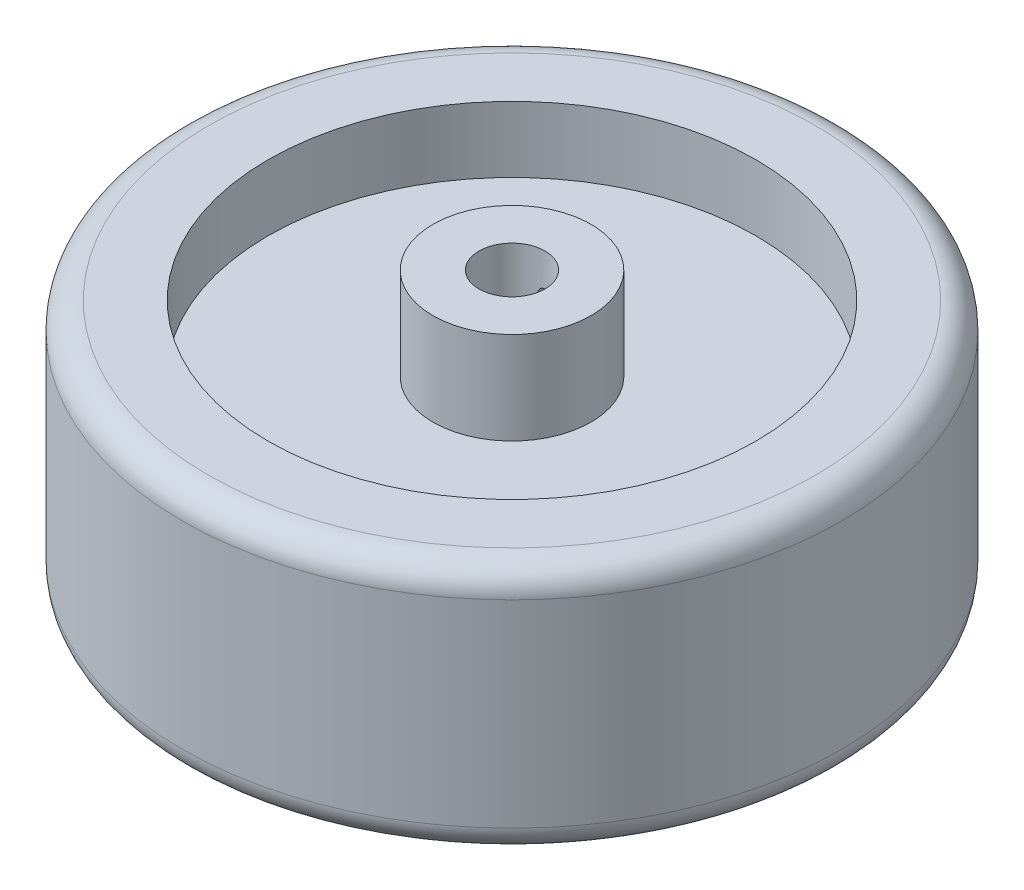
ISO-10303-21;
HEADER;
FILE_DESCRIPTION(('STEP AP214'),'2;1');
FILE_NAME('part.step','',(''),(''),'','','');
FILE_SCHEMA(('AUTOMOTIVE_DESIGN { 1 0 10303 214 1 1 1 1 }'));
ENDSEC;
DATA;
#1=APPLICATION_CONTEXT('core data for automotive mechanical design processes');
#2=APPLICATION_PROTOCOL_DEFINITION('international standard','automotive_design',2000,#1);
#3=PRODUCT_CONTEXT('',#1,'mechanical');
#4=PRODUCT('Part','Part','',(#3));
#5=PRODUCT_RELATED_PRODUCT_CATEGORY('part','',(#4));
#6=PRODUCT_DEFINITION_FORMATION('','',#4);
#7=PRODUCT_DEFINITION_CONTEXT('part definition',#1,'design');
#8=PRODUCT_DEFINITION('design','',#6,#7);
#9=PRODUCT_DEFINITION_SHAPE('','',#8);
#10=(LENGTH_UNIT() NAMED_UNIT(*) SI_UNIT(.MILLI.,.METRE.));
#11=(NAMED_UNIT(*) PLANE_ANGLE_UNIT() SI_UNIT($,.RADIAN.));
#12=(NAMED_UNIT(*) SI_UNIT($,.STERADIAN.) SOLID_ANGLE_UNIT());
#13=UNCERTAINTY_MEASURE_WITH_UNIT(LENGTH_MEASURE(1.E-05),#10,'distance_accuracy_value','');
#14=(GEOMETRIC_REPRESENTATION_CONTEXT(3) GLOBAL_UNCERTAINTY_ASSIGNED_CONTEXT((#13)) GLOBAL_UNIT_ASSIGNED_CONTEXT((#10,
#11,#12)) REPRESENTATION_CONTEXT('',''));
#15=CARTESIAN_POINT('',(0.,0.,0.));
#16=DIRECTION('',(0.,0.,1.));
#17=DIRECTION('',(1.,0.,0.));
#18=AXIS2_PLACEMENT_3D('',#15,#16,#17);
#19=CARTESIAN_POINT('',(0.,38.,0.));
#20=DIRECTION('',(0.,-1.,0.));
#21=DIRECTION('',(0.,0.,-1.));
#22=AXIS2_PLACEMENT_3D('',#19,#20,#21);
#23=CYLINDRICAL_SURFACE('',#22,50.);
#24=CARTESIAN_POINT('',(0.,34.,0.));
#25=DIRECTION('',(0.,1.,0.));
#26=DIRECTION('',(0.,0.,1.));
#27=AXIS2_PLACEMENT_3D('',#24,#25,#26);
#28=CIRCLE('',#27,50.);
#29=CARTESIAN_POINT('',(0.,34.,50.));
#30=VERTEX_POINT('',#29);
#31=EDGE_CURVE('E48',#30,#30,#28,.F.);
#32=ORIENTED_EDGE('',*,*,#31,.T.);
#33=EDGE_LOOP('',(#32));
#34=FACE_BOUND('',#33,.T.);
#35=CARTESIAN_POINT('',(0.,4.,0.));
#36=DIRECTION('',(0.,1.,0.));
#37=DIRECTION('',(0.,0.,1.));
#38=AXIS2_PLACEMENT_3D('',#35,#36,#37);
#39=CIRCLE('',#38,50.);
#40=CARTESIAN_POINT('',(0.,4.,50.));
#41=VERTEX_POINT('',#40);
#42=EDGE_CURVE('E52',#41,#41,#39,.T.);
#43=ORIENTED_EDGE('',*,*,#42,.T.);
#44=EDGE_LOOP('',(#43));
#45=FACE_BOUND('',#44,.T.);
#46=ADVANCED_FACE('F36',(#34,#45),#23,.T.);
#47=CARTESIAN_POINT('',(0.,38.,0.));
#48=DIRECTION('',(0.,1.,0.));
#49=DIRECTION('',(0.,0.,1.));
#50=AXIS2_PLACEMENT_3D('',#47,#48,#49);
#51=PLANE('',#50);
#52=CARTESIAN_POINT('',(0.,38.,0.));
#53=DIRECTION('',(0.,1.,0.));
#54=DIRECTION('',(0.,0.,1.));
#55=AXIS2_PLACEMENT_3D('',#52,#53,#54);
#56=CIRCLE('',#55,46.);
#57=CARTESIAN_POINT('',(0.,38.,46.));
#58=VERTEX_POINT('',#57);
#59=EDGE_CURVE('E57',#58,#58,#56,.T.);
#60=ORIENTED_EDGE('',*,*,#59,.T.);
#61=EDGE_LOOP('',(#60));
#62=FACE_BOUND('',#61,.T.);
#63=CARTESIAN_POINT('',(0.,38.,0.));
#64=DIRECTION('',(0.,1.,0.));
#65=DIRECTION('',(0.,0.,1.));
#66=AXIS2_PLACEMENT_3D('',#63,#64,#65);
#67=CIRCLE('',#66,37.);
#68=CARTESIAN_POINT('',(0.,38.,37.));
#69=VERTEX_POINT('',#68);
#70=EDGE_CURVE('E82',#69,#69,#67,.T.);
#71=ORIENTED_EDGE('',*,*,#70,.F.);
#72=EDGE_LOOP('',(#71));
#73=FACE_BOUND('',#72,.T.);
#74=ADVANCED_FACE('F136',(#62,#73),#51,.T.);
#75=CARTESIAN_POINT('',(0.,0.,0.));
#76=DIRECTION('',(0.,1.,0.));
#77=DIRECTION('',(0.,0.,1.));
#78=AXIS2_PLACEMENT_3D('',#75,#76,#77);
#79=PLANE('',#78);
#80=CARTESIAN_POINT('',(0.,0.,0.));
#81=DIRECTION('',(0.,1.,0.));
#82=DIRECTION('',(0.,0.,1.));
#83=AXIS2_PLACEMENT_3D('',#80,#81,#82);
#84=CIRCLE('',#83,46.);
#85=CARTESIAN_POINT('',(0.,0.,46.));
#86=VERTEX_POINT('',#85);
#87=EDGE_CURVE('E11',#86,#86,#84,.F.);
#88=ORIENTED_EDGE('',*,*,#87,.T.);
#89=EDGE_LOOP('',(#88));
#90=FACE_BOUND('',#89,.T.);
#91=CARTESIAN_POINT('',(0.,0.,0.));
#92=DIRECTION('',(0.,-1.,0.));
#93=DIRECTION('',(0.,0.,-1.));
#94=AXIS2_PLACEMENT_3D('',#91,#92,#93);
#95=CIRCLE('',#94,37.);
#96=CARTESIAN_POINT('',(0.,0.,-37.));
#97=VERTEX_POINT('',#96);
#98=EDGE_CURVE('E73',#97,#97,#95,.T.);
#99=ORIENTED_EDGE('',*,*,#98,.F.);
#100=EDGE_LOOP('',(#99));
#101=FACE_BOUND('',#100,.T.);
#102=ADVANCED_FACE('F128',(#90,#101),#79,.F.);
#103=CARTESIAN_POINT('',(0.,-4.,0.));
#104=DIRECTION('',(0.,-1.,0.));
#105=DIRECTION('',(0.,0.,-1.));
#106=AXIS2_PLACEMENT_3D('',#103,#104,#105);
#107=PLANE('',#106);
#108=CARTESIAN_POINT('',(0.,-4.,0.));
#109=DIRECTION('',(0.,-1.,0.));
#110=DIRECTION('',(0.,0.,-1.));
#111=AXIS2_PLACEMENT_3D('',#108,#109,#110);
#112=CIRCLE('',#111,5.);
#113=CARTESIAN_POINT('',(0.,-4.,-5.));
#114=VERTEX_POINT('',#113);
#115=EDGE_CURVE('E65',#114,#114,#112,.T.);
#116=ORIENTED_EDGE('',*,*,#115,.F.);
#117=EDGE_LOOP('',(#116));
#118=FACE_BOUND('',#117,.T.);
#119=CARTESIAN_POINT('',(0.,-4.,0.));
#120=DIRECTION('',(0.,-1.,0.));
#121=DIRECTION('',(0.,0.,-1.));
#122=AXIS2_PLACEMENT_3D('',#119,#120,#121);
#123=CIRCLE('',#122,12.);
#124=CARTESIAN_POINT('',(0.,-4.,-12.));
#125=VERTEX_POINT('',#124);
#126=EDGE_CURVE('E64',#125,#125,#123,.T.);
#127=ORIENTED_EDGE('',*,*,#126,.T.);
#128=EDGE_LOOP('',(#127));
#129=FACE_BOUND('',#128,.T.);
#130=ADVANCED_FACE('F125',(#118,#129),#107,.T.);
#131=CARTESIAN_POINT('',(0.,79.9411254969543,0.));
#132=DIRECTION('',(0.,-1.,0.));
#133=DIRECTION('',(0.,0.,-1.));
#134=AXIS2_PLACEMENT_3D('',#131,#132,#133);
#135=CYLINDRICAL_SURFACE('',#134,12.);
#136=ORIENTED_EDGE('',*,*,#126,.F.);
#137=EDGE_LOOP('',(#136));
#138=FACE_BOUND('',#137,.T.);
#139=CARTESIAN_POINT('',(0.,10.,0.));
#140=DIRECTION('',(0.,-1.,0.));
#141=DIRECTION('',(0.,0.,-1.));
#142=AXIS2_PLACEMENT_3D('',#139,#140,#141);
#143=CIRCLE('',#142,12.);
#144=CARTESIAN_POINT('',(0.,10.,-12.));
#145=VERTEX_POINT('',#144);
#146=EDGE_CURVE('E76',#145,#145,#143,.T.);
#147=ORIENTED_EDGE('',*,*,#146,.T.);
#148=EDGE_LOOP('',(#147));
#149=FACE_BOUND('',#148,.T.);
#150=ADVANCED_FACE('F127',(#138,#149),#135,.T.);
#151=CARTESIAN_POINT('',(0.,42.,0.));
#152=DIRECTION('',(0.,1.,0.));
#153=DIRECTION('',(0.,0.,1.));
#154=AXIS2_PLACEMENT_3D('',#151,#152,#153);
#155=PLANE('',#154);
#156=CARTESIAN_POINT('',(0.,42.,0.));
#157=DIRECTION('',(0.,1.,0.));
#158=DIRECTION('',(0.,0.,1.));
#159=AXIS2_PLACEMENT_3D('',#156,#157,#158);
#160=CIRCLE('',#159,5.);
#161=CARTESIAN_POINT('',(0.,42.,5.));
#162=VERTEX_POINT('',#161);
#163=EDGE_CURVE('E61',#162,#162,#160,.T.);
#164=ORIENTED_EDGE('',*,*,#163,.F.);
#165=EDGE_LOOP('',(#164));
#166=FACE_BOUND('',#165,.T.);
#167=CARTESIAN_POINT('',(0.,42.,0.));
#168=DIRECTION('',(0.,1.,0.));
#169=DIRECTION('',(0.,0.,1.));
#170=AXIS2_PLACEMENT_3D('',#167,#168,#169);
#171=CIRCLE('',#170,12.);
#172=CARTESIAN_POINT('',(0.,42.,12.));
#173=VERTEX_POINT('',#172);
#174=EDGE_CURVE('E60',#173,#173,#171,.F.);
#175=ORIENTED_EDGE('',*,*,#174,.F.);
#176=EDGE_LOOP('',(#175));
#177=FACE_BOUND('',#176,.T.);
#178=ADVANCED_FACE('F134',(#166,#177),#155,.T.);
#179=CARTESIAN_POINT('',(0.,37.,-12.));
#180=CARTESIAN_POINT('',(0.0560660899212044,36.9999975511737,-11.9999994541152));
#181=CARTESIAN_POINT('',(0.112170347180226,36.995269030189,-11.999602885434));
#182=CARTESIAN_POINT('',(0.22282657070039,36.9764756481449,-11.9980590232825));
#183=CARTESIAN_POINT('',(0.277376705225231,36.9624002096951,-11.9969108793169));
#184=CARTESIAN_POINT('',(0.383306022514263,36.9253228461906,-11.993993612461));
#185=CARTESIAN_POINT('',(0.434686980424619,36.9023259718902,-11.9922248409849));
#186=CARTESIAN_POINT('',(0.532847233416079,36.848067568128,-11.9882646774471));
#187=CARTESIAN_POINT('',(0.579627509885391,36.8168078065225,-11.9860733758136));
#188=CARTESIAN_POINT('',(0.667389999965593,36.746824933394,-11.9815077986671));
#189=CARTESIAN_POINT('',(0.708358872416165,36.7080851160643,-11.9791331208658));
#190=CARTESIAN_POINT('',(0.783221133536557,36.6242771041501,-11.9744718080317));
#191=CARTESIAN_POINT('',(0.817114211371507,36.5792086316974,-11.9721851768704));
#192=CARTESIAN_POINT('',(0.876907922390229,36.483941882901,-11.9679545266124));
#193=CARTESIAN_POINT('',(0.902796832951544,36.4337362245972,-11.9660110118009));
#194=CARTESIAN_POINT('',(0.945772433773847,36.329671704444,-11.9626912444827));
#195=CARTESIAN_POINT('',(0.962859279512418,36.2758129071417,-11.9613149819563));
#196=CARTESIAN_POINT('',(0.987707029818572,36.1661046081188,-11.9592889206632));
#197=CARTESIAN_POINT('',(0.995489665389776,36.1102600600074,-11.9586374293622));
#198=CARTESIAN_POINT('',(1.00157520801543,35.9980537960546,-11.9581293232148));
#199=CARTESIAN_POINT('',(0.99987829297954,35.941692089939,-11.9582726934506));
#200=CARTESIAN_POINT('',(0.987070864214849,35.8302003344895,-11.9593365736164));
#201=CARTESIAN_POINT('',(0.975983968038058,35.7750675509236,-11.9602551337785));
#202=CARTESIAN_POINT('',(0.944747985382942,35.667448132607,-11.9627628356937));
#203=CARTESIAN_POINT('',(0.924598810396786,35.6149615237061,-11.964351983996));
#204=CARTESIAN_POINT('',(0.875783788152035,35.5140490941219,-11.9680240470685));
#205=CARTESIAN_POINT('',(0.847107344757195,35.4656284224125,-11.9701075755096));
#206=CARTESIAN_POINT('',(0.78205944391335,35.3742786611802,-11.9745330686388));
#207=CARTESIAN_POINT('',(0.745687830622545,35.3313496829028,-11.9768750385603));
#208=CARTESIAN_POINT('',(0.666149582226366,35.2520645807184,-11.9815622041165));
#209=CARTESIAN_POINT('',(0.622962529390578,35.2157289358707,-11.9839073877507));
#210=CARTESIAN_POINT('',(0.531090556371752,35.1508202766114,-11.9883299186983));
#211=CARTESIAN_POINT('',(0.482405632515338,35.1222472673864,-11.9904072658329));
#212=CARTESIAN_POINT('',(0.38090659326785,35.0736762373313,-11.9940604580964));
#213=CARTESIAN_POINT('',(0.328092041809073,35.0536791235218,-11.9956362501744));
#214=CARTESIAN_POINT('',(0.21983906901958,35.0228418675487,-11.998108174118));
#215=CARTESIAN_POINT('',(0.164400702168852,35.0120015353447,-11.9990043200889));
#216=CARTESIAN_POINT('',(0.0526513001642479,34.9998112359584,-12.0000141694305));
#217=CARTESIAN_POINT('',(-0.0036566291151987,34.9984329818931,-12.00013020492));
#218=CARTESIAN_POINT('',(-0.115702752503305,35.0051318606273,-11.999572987787));
#219=CARTESIAN_POINT('',(-0.171440951921414,35.0132089052295,-11.9988997425267));
#220=CARTESIAN_POINT('',(-0.2806847562247,35.0385656586101,-11.9968411784132));
#221=CARTESIAN_POINT('',(-0.334193425139723,35.0558322560258,-11.9954568741742));
#222=CARTESIAN_POINT('',(-0.43755416508249,35.099064587782,-11.9921317011235));
#223=CARTESIAN_POINT('',(-0.487406178283133,35.1250304596585,-11.9901908235124));
#224=CARTESIAN_POINT('',(-0.582167218301909,35.1849953492164,-11.9859642639363));
#225=CARTESIAN_POINT('',(-0.627064350521472,35.2190131063948,-11.9836777821874));
#226=CARTESIAN_POINT('',(-0.710521094843624,35.2940890570505,-11.979019586397));
#227=CARTESIAN_POINT('',(-0.749080596814385,35.3351473728493,-11.9766478708753));
#228=CARTESIAN_POINT('',(-0.818864545455103,35.4232616921983,-11.9720796121582));
#229=CARTESIAN_POINT('',(-0.85007053323364,35.4703323411974,-11.9698835187422));
#230=CARTESIAN_POINT('',(-0.90413506283952,35.5690622628634,-11.9659215174432));
#231=CARTESIAN_POINT('',(-0.926993688009967,35.6207214897099,-11.9641556052652));
#232=CARTESIAN_POINT('',(-0.963683177440568,35.7270967905392,-11.9612564284894));
#233=CARTESIAN_POINT('',(-0.977525341449294,35.7818089447143,-11.9601223722863));
#234=CARTESIAN_POINT('',(-0.995825769910155,35.8927906998744,-11.9586126569085));
#235=CARTESIAN_POINT('',(-1.00028421456827,35.9490602709296,-11.9582369831697));
#236=CARTESIAN_POINT('',(-0.999688562890931,36.0613761260209,-11.9582867795019));
#237=CARTESIAN_POINT('',(-0.994663469777391,36.1174225672364,-11.9587098069307));
#238=CARTESIAN_POINT('',(-0.97530386329503,36.2278725335509,-11.9603041508231));
#239=CARTESIAN_POINT('',(-0.960969335727628,36.2822760561438,-11.961475468428));
#240=CARTESIAN_POINT('',(-0.923405110017061,36.3878977632666,-11.9644337713171));
#241=CARTESIAN_POINT('',(-0.900175934006531,36.4391161345657,-11.9662207204619));
#242=CARTESIAN_POINT('',(-0.845485058947247,36.5369308405737,-11.9702089987507));
#243=CARTESIAN_POINT('',(-0.814023489114556,36.5835272478133,-11.9724103213905));
#244=CARTESIAN_POINT('',(-0.743651942122448,36.670923739013,-11.9769873169868));
#245=CARTESIAN_POINT('',(-0.70472049374146,36.7117065086574,-11.9793634800574));
#246=CARTESIAN_POINT('',(-0.620553225592465,36.7861751852033,-11.9840179500968));
#247=CARTESIAN_POINT('',(-0.575315882641091,36.819859372496,-11.9862962332482));
#248=CARTESIAN_POINT('',(-0.479733773029414,36.8792198604176,-11.9905023484227));
#249=CARTESIAN_POINT('',(-0.429379656270537,36.9048811386563,-11.992429520231));
#250=CARTESIAN_POINT('',(-0.325095751995733,36.9473518030513,-11.995708525163));
#251=CARTESIAN_POINT('',(-0.27117015541365,36.9641713642881,-11.9970610192826));
#252=CARTESIAN_POINT('',(-0.180772048096679,36.984197582502,-11.9986910773385));
#253=CARTESIAN_POINT('',(-0.144880894438471,36.9901156125175,-11.9991796887695));
#254=CARTESIAN_POINT('',(-0.0726651715011627,36.9980176096772,-11.9998343265863));
#255=CARTESIAN_POINT('',(-0.0363406033730451,37.0000015872665,-12.0000003538286));
#256=CARTESIAN_POINT('',(0.,37.,-12.));
#257=B_SPLINE_CURVE_WITH_KNOTS('',3,(#179,#180,#181,#182,#183,#184,#185,#186,#187,#188,#189,
#190,#191,#192,#193,#194,#195,#196,#197,#198,#199,#200,#201,#202,#203,#204,#205,#206,#207,#208,
#209,#210,#211,#212,#213,#214,#215,#216,#217,#218,#219,#220,#221,#222,#223,#224,#225,#226,#227,
#228,#229,#230,#231,#232,#233,#234,#235,#236,#237,#238,#239,#240,#241,#242,#243,#244,#245,#246,
#247,#248,#249,#250,#251,#252,#253,#254,#255,#256),.UNSPECIFIED.,.T.,.F.,(4,2,2,2,2,2,2,2,2,2,2,
2,2,2,2,2,2,2,2,2,2,2,2,2,2,2,2,2,2,2,2,2,2,2,2,2,2,2,4),(0.,0.168065586800139,
0.336321688997836,0.504482673888957,0.672607709584187,0.841112668785768,1.00962502873932,
1.17838302951091,1.34713804927902,1.51549814831587,1.68385508762619,1.8517898311029,
2.01972621476999,2.18787215748899,2.3560215058086,2.52468450935149,2.69334762558645,
2.86202857590451,3.03070602532536,3.19887899307169,3.36705039214222,3.53498249030786,
3.70291724361373,3.87124674974928,4.03957918071251,4.20832976491202,4.37707866419829,
4.5456156724093,4.71414944398758,4.88216862882528,5.05018806992341,5.21819764947525,
5.38620459209857,5.5547018866464,5.72323995232481,5.89209173062554,6.06074876591786,
6.16968486356663,6.27862067198747),.UNSPECIFIED.);
#258=CARTESIAN_POINT('',(0.,37.,-12.));
#259=VERTEX_POINT('',#258);
#260=EDGE_CURVE('E90',#259,#259,#257,.T.);
#261=ORIENTED_EDGE('',*,*,#260,.F.);
#262=EDGE_LOOP('',(#261));
#263=FACE_BOUND('',#262,.T.);
#264=ORIENTED_EDGE('',*,*,#174,.T.);
#265=EDGE_LOOP('',(#264));
#266=FACE_BOUND('',#265,.T.);
#267=CARTESIAN_POINT('',(0.,28.,0.));
#268=DIRECTION('',(0.,1.,0.));
#269=DIRECTION('',(0.,0.,1.));
#270=AXIS2_PLACEMENT_3D('',#267,#268,#269);
#271=CIRCLE('',#270,12.);
#272=CARTESIAN_POINT('',(0.,28.,12.));
#273=VERTEX_POINT('',#272);
#274=EDGE_CURVE('E85',#273,#273,#271,.T.);
#275=ORIENTED_EDGE('',*,*,#274,.T.);
#276=EDGE_LOOP('',(#275));
#277=FACE_BOUND('',#276,.T.);
#278=ADVANCED_FACE('F95',(#263,#266,#277),#135,.T.);
#279=CARTESIAN_POINT('',(0.,73.,0.));
#280=DIRECTION('',(0.,-1.,0.));
#281=DIRECTION('',(0.,0.,-1.));
#282=AXIS2_PLACEMENT_3D('',#279,#280,#281);
#283=CYLINDRICAL_SURFACE('',#282,5.);
#284=CARTESIAN_POINT('',(0.,37.,-5.));
#285=CARTESIAN_POINT('',(0.0555769067926333,36.9999979555016,-4.99999897580871));
#286=CARTESIAN_POINT('',(0.111179660201522,36.9953511570323,-4.99906385178231));
#287=CARTESIAN_POINT('',(0.22081350768902,36.9769014998848,-4.99542365623231));
#288=CARTESIAN_POINT('',(0.274843317541357,36.9630913671985,-4.99271717860186));
#289=CARTESIAN_POINT('',(0.379730305263315,36.9267587263792,-4.98583649278287));
#290=CARTESIAN_POINT('',(0.430590467933137,36.9042445631553,-4.98166369076718));
#291=CARTESIAN_POINT('',(0.527807988864229,36.8511677524887,-4.97230398035314));
#292=CARTESIAN_POINT('',(0.574165615075816,36.8206055843928,-4.96711713235707));
#293=CARTESIAN_POINT('',(0.661693477314868,36.7518615057086,-4.9562216532997));
#294=CARTESIAN_POINT('',(0.702793951158526,36.7135916446088,-4.95050745504347));
#295=CARTESIAN_POINT('',(0.778036756608028,36.6307075836083,-4.93924180452588));
#296=CARTESIAN_POINT('',(0.812178544770425,36.5860928886649,-4.93369036500424));
#297=CARTESIAN_POINT('',(0.872831753347621,36.4912838069881,-4.92332441812615));
#298=CARTESIAN_POINT('',(0.899270938865868,36.4410423562036,-4.91851707364946));
#299=CARTESIAN_POINT('',(0.943305666580309,36.3367181809959,-4.91026268058418));
#300=CARTESIAN_POINT('',(0.960902082437239,36.2826358366536,-4.90681549761962));
#301=CARTESIAN_POINT('',(0.986525299884828,36.1729156360921,-4.90172805252204));
#302=CARTESIAN_POINT('',(0.994674497958778,36.1173074558578,-4.90006470107188));
#303=CARTESIAN_POINT('',(1.00155212772612,36.0054901786357,-4.89866375060627));
#304=CARTESIAN_POINT('',(1.0002815227135,35.9492811436799,-4.89892595467841));
#305=CARTESIAN_POINT('',(0.98845457310182,35.838753211979,-4.90132551148185));
#306=CARTESIAN_POINT('',(0.978038540243907,35.7844185943727,-4.90343452858763));
#307=CARTESIAN_POINT('',(0.948437884623052,35.678283923337,-4.90924546160001));
#308=CARTESIAN_POINT('',(0.929252843100681,35.626483991081,-4.91294745357779));
#309=CARTESIAN_POINT('',(0.882524783674719,35.5264847382964,-4.92155618500408));
#310=CARTESIAN_POINT('',(0.854926151232114,35.4783121204308,-4.92647089813704));
#311=CARTESIAN_POINT('',(0.792193574572679,35.3872291500272,-4.93694618773062));
#312=CARTESIAN_POINT('',(0.757058764356829,35.3443194031488,-4.94250683838366));
#313=CARTESIAN_POINT('',(0.679499934560584,35.2641705975431,-4.95377021241462));
#314=CARTESIAN_POINT('',(0.636956161212446,35.2270474321409,-4.95947369210905));
#315=CARTESIAN_POINT('',(0.546185024062012,35.1604461536988,-4.97028848714408));
#316=CARTESIAN_POINT('',(0.49795758737939,35.1309681387064,-4.97539979488974));
#317=CARTESIAN_POINT('',(0.397059386878921,35.080472490774,-4.98446690160887));
#318=CARTESIAN_POINT('',(0.3443818195853,35.0594681063555,-4.98842088848272));
#319=CARTESIAN_POINT('',(0.236148976448664,35.0266395259614,-4.99471408987858));
#320=CARTESIAN_POINT('',(0.180594050072448,35.0148142179264,-4.99705350000531));
#321=CARTESIAN_POINT('',(0.0691794056271478,35.0008435462057,-4.99982671866868));
#322=CARTESIAN_POINT('',(0.0133403283255736,34.9985395804597,-5.0002917465247));
#323=CARTESIAN_POINT('',(-0.0979249341927162,35.0032498589422,-4.99935051930103));
#324=CARTESIAN_POINT('',(-0.153351142443795,35.0102635793526,-4.99794436941446));
#325=CARTESIAN_POINT('',(-0.261705659946543,35.033278373544,-4.99343832008018));
#326=CARTESIAN_POINT('',(-0.314651948339906,35.0491980684979,-4.99035376404206));
#327=CARTESIAN_POINT('',(-0.41712362749967,35.0894839826558,-4.98283552061033));
#328=CARTESIAN_POINT('',(-0.466648761637542,35.1138508346768,-4.97840173214227));
#329=CARTESIAN_POINT('',(-0.561541173686218,35.1706824906513,-4.96859911533294));
#330=CARTESIAN_POINT('',(-0.606850126752188,35.2032427810389,-4.96321950437052));
#331=CARTESIAN_POINT('',(-0.691418019119207,35.2754091912073,-4.95214734829882));
#332=CARTESIAN_POINT('',(-0.730676308930763,35.3150160663999,-4.94645476968388));
#333=CARTESIAN_POINT('',(-0.802640590774178,35.4008733518911,-4.93529303556965));
#334=CARTESIAN_POINT('',(-0.835237702448659,35.4472157442213,-4.92982860233304));
#335=CARTESIAN_POINT('',(-0.89218542005121,35.5448113613567,-4.91984191796194));
#336=CARTESIAN_POINT('',(-0.916536355922906,35.5960643895736,-4.91531962913342));
#337=CARTESIAN_POINT('',(-0.956151841581962,35.7017682461496,-4.90776740584383));
#338=CARTESIAN_POINT('',(-0.971463499791052,35.7562008412103,-4.90472974872187));
#339=CARTESIAN_POINT('',(-0.992708651627197,35.8669334534909,-4.90047436792025));
#340=CARTESIAN_POINT('',(-0.998643368225114,35.9232332262093,-4.89925640691111));
#341=CARTESIAN_POINT('',(-1.00092091086747,36.0350088645443,-4.89879149631379));
#342=CARTESIAN_POINT('',(-0.997435788070896,36.090481148927,-4.89950919189301));
#343=CARTESIAN_POINT('',(-0.981352304100061,36.200031649905,-4.90275573484614));
#344=CARTESIAN_POINT('',(-0.968754016129298,36.2541098776948,-4.90528456767169));
#345=CARTESIAN_POINT('',(-0.934878568498954,36.3592277112405,-4.91185264219159));
#346=CARTESIAN_POINT('',(-0.913622506717344,36.4102743605024,-4.91588821018831));
#347=CARTESIAN_POINT('',(-0.863054644601603,36.5081037207344,-4.9250171497417));
#348=CARTESIAN_POINT('',(-0.83374216877488,36.5548860737251,-4.93011060998894));
#349=CARTESIAN_POINT('',(-0.767305914786412,36.6437155721503,-4.94088960523225));
#350=CARTESIAN_POINT('',(-0.730057887235179,36.6856687652676,-4.94658372909699));
#351=CARTESIAN_POINT('',(-0.649064369013138,36.7627862055292,-4.95786081871955));
#352=CARTESIAN_POINT('',(-0.605317387153331,36.7979488903173,-4.96344375863185));
#353=CARTESIAN_POINT('',(-0.512017629088242,36.8608346439464,-4.97393832387972));
#354=CARTESIAN_POINT('',(-0.462408884429832,36.88847600328,-4.97884231219246));
#355=CARTESIAN_POINT('',(-0.359166360940733,36.9349861225966,-4.98735125085));
#356=CARTESIAN_POINT('',(-0.305536260863128,36.9538627895325,-4.99095737138616));
#357=CARTESIAN_POINT('',(-0.209821488923782,36.9786519480447,-4.99576372595371));
#358=CARTESIAN_POINT('',(-0.168281664013787,36.9866431937078,-4.99734303158452));
#359=CARTESIAN_POINT('',(-0.0844995252100685,36.9973179123584,-4.99946154139893));
#360=CARTESIAN_POINT('',(-0.0422572337486198,37.0000015545098,-5.00000077873155));
#361=CARTESIAN_POINT('',(0.,37.,-5.));
#362=B_SPLINE_CURVE_WITH_KNOTS('',3,(#284,#285,#286,#287,#288,#289,#290,#291,#292,#293,#294,
#295,#296,#297,#298,#299,#300,#301,#302,#303,#304,#305,#306,#307,#308,#309,#310,#311,#312,#313,
#314,#315,#316,#317,#318,#319,#320,#321,#322,#323,#324,#325,#326,#327,#328,#329,#330,#331,#332,
#333,#334,#335,#336,#337,#338,#339,#340,#341,#342,#343,#344,#345,#346,#347,#348,#349,#350,#351,
#352,#353,#354,#355,#356,#357,#358,#359,#360,#361),.UNSPECIFIED.,.T.,.F.,(4,2,2,2,2,2,2,2,2,2,2,
2,2,2,2,2,2,2,2,2,2,2,2,2,2,2,2,2,2,2,2,2,2,2,2,2,2,2,4),(0.,0.166576130661259,
0.333284650691324,0.499833735250347,0.666372902230865,0.834932670112186,1.00350559674736,
1.17361195005923,1.34370149365198,1.51156185103587,1.67940504281225,1.84471727006278,
2.0100373925373,2.17647490203593,2.34293154749671,2.5123825249135,2.6818356753982,
2.85155274854024,3.02124925698036,3.18810735676266,3.35495607657868,3.52030453950724,
3.68566539216023,3.85305066033359,4.0204538834593,4.19040628579227,4.36035188723467,
4.52940381032724,4.69843368330415,4.86439722567702,5.03035943492609,5.19591961253111,
5.36149367581867,5.52988076239144,5.69830654532932,5.86849496675638,6.03852955517519,
6.16518775289894,6.29184191370997),.UNSPECIFIED.);
#363=CARTESIAN_POINT('',(0.,37.,-5.));
#364=VERTEX_POINT('',#363);
#365=EDGE_CURVE('E40',#364,#364,#362,.T.);
#366=ORIENTED_EDGE('',*,*,#365,.T.);
#367=EDGE_LOOP('',(#366));
#368=FACE_BOUND('',#367,.T.);
#369=ORIENTED_EDGE('',*,*,#163,.T.);
#370=EDGE_LOOP('',(#369));
#371=FACE_BOUND('',#370,.T.);
#372=ORIENTED_EDGE('',*,*,#115,.T.);
#373=EDGE_LOOP('',(#372));
#374=FACE_BOUND('',#373,.T.);
#375=ADVANCED_FACE('F120',(#368,#371,#374),#283,.F.);
#376=CARTESIAN_POINT('',(0.,10.,0.));
#377=DIRECTION('',(0.,-1.,0.));
#378=DIRECTION('',(0.,0.,-1.));
#379=AXIS2_PLACEMENT_3D('',#376,#377,#378);
#380=CYLINDRICAL_SURFACE('',#379,37.);
#381=CARTESIAN_POINT('',(0.,10.,0.));
#382=DIRECTION('',(0.,-1.,0.));
#383=DIRECTION('',(0.,0.,-1.));
#384=AXIS2_PLACEMENT_3D('',#381,#382,#383);
#385=CIRCLE('',#384,37.);
#386=CARTESIAN_POINT('',(0.,10.,-37.));
#387=VERTEX_POINT('',#386);
#388=EDGE_CURVE('E72',#387,#387,#385,.T.);
#389=ORIENTED_EDGE('',*,*,#388,.F.);
#390=EDGE_LOOP('',(#389));
#391=FACE_BOUND('',#390,.T.);
#392=ORIENTED_EDGE('',*,*,#98,.T.);
#393=EDGE_LOOP('',(#392));
#394=FACE_BOUND('',#393,.T.);
#395=ADVANCED_FACE('F117',(#391,#394),#380,.F.);
#396=CARTESIAN_POINT('',(0.,10.,0.));
#397=DIRECTION('',(0.,-1.,0.));
#398=DIRECTION('',(0.,0.,-1.));
#399=AXIS2_PLACEMENT_3D('',#396,#397,#398);
#400=PLANE('',#399);
#401=ORIENTED_EDGE('',*,*,#146,.F.);
#402=EDGE_LOOP('',(#401));
#403=FACE_BOUND('',#402,.T.);
#404=ORIENTED_EDGE('',*,*,#388,.T.);
#405=EDGE_LOOP('',(#404));
#406=FACE_BOUND('',#405,.T.);
#407=ADVANCED_FACE('F113',(#403,#406),#400,.T.);
#408=CARTESIAN_POINT('',(0.,28.,0.));
#409=DIRECTION('',(0.,1.,0.));
#410=DIRECTION('',(0.,0.,1.));
#411=AXIS2_PLACEMENT_3D('',#408,#409,#410);
#412=CYLINDRICAL_SURFACE('',#411,37.);
#413=CARTESIAN_POINT('',(0.,28.,0.));
#414=DIRECTION('',(0.,1.,0.));
#415=DIRECTION('',(0.,0.,1.));
#416=AXIS2_PLACEMENT_3D('',#413,#414,#415);
#417=CIRCLE('',#416,37.);
#418=CARTESIAN_POINT('',(0.,28.,37.));
#419=VERTEX_POINT('',#418);
#420=EDGE_CURVE('E81',#419,#419,#417,.T.);
#421=ORIENTED_EDGE('',*,*,#420,.F.);
#422=EDGE_LOOP('',(#421));
#423=FACE_BOUND('',#422,.T.);
#424=ORIENTED_EDGE('',*,*,#70,.T.);
#425=EDGE_LOOP('',(#424));
#426=FACE_BOUND('',#425,.T.);
#427=ADVANCED_FACE('F109',(#423,#426),#412,.F.);
#428=CARTESIAN_POINT('',(0.,28.,0.));
#429=DIRECTION('',(0.,1.,0.));
#430=DIRECTION('',(0.,0.,1.));
#431=AXIS2_PLACEMENT_3D('',#428,#429,#430);
#432=PLANE('',#431);
#433=ORIENTED_EDGE('',*,*,#274,.F.);
#434=EDGE_LOOP('',(#433));
#435=FACE_BOUND('',#434,.T.);
#436=ORIENTED_EDGE('',*,*,#420,.T.);
#437=EDGE_LOOP('',(#436));
#438=FACE_BOUND('',#437,.T.);
#439=ADVANCED_FACE('F104',(#435,#438),#432,.T.);
#440=CARTESIAN_POINT('',(0.,34.,0.));
#441=DIRECTION('',(0.,1.,0.));
#442=DIRECTION('',(0.,0.,1.));
#443=AXIS2_PLACEMENT_3D('',#440,#441,#442);
#444=TOROIDAL_SURFACE('',#443,46.,4.);
#445=ORIENTED_EDGE('',*,*,#31,.F.);
#446=EDGE_LOOP('',(#445));
#447=FACE_BOUND('',#446,.T.);
#448=ORIENTED_EDGE('',*,*,#59,.F.);
#449=EDGE_LOOP('',(#448));
#450=FACE_BOUND('',#449,.T.);
#451=ADVANCED_FACE('F108',(#447,#450),#444,.T.);
#452=CARTESIAN_POINT('',(0.,4.,0.));
#453=DIRECTION('',(0.,1.,0.));
#454=DIRECTION('',(0.,0.,1.));
#455=AXIS2_PLACEMENT_3D('',#452,#453,#454);
#456=TOROIDAL_SURFACE('',#455,46.,4.);
#457=ORIENTED_EDGE('',*,*,#87,.F.);
#458=EDGE_LOOP('',(#457));
#459=FACE_BOUND('',#458,.T.);
#460=ORIENTED_EDGE('',*,*,#42,.F.);
#461=EDGE_LOOP('',(#460));
#462=FACE_BOUND('',#461,.T.);
#463=ADVANCED_FACE('F38',(#459,#462),#456,.T.);
#464=CARTESIAN_POINT('',(0.,36.,-12.));
#465=DIRECTION('',(0.,0.,1.));
#466=DIRECTION('',(1.,0.,0.));
#467=AXIS2_PLACEMENT_3D('',#464,#465,#466);
#468=CYLINDRICAL_SURFACE('',#467,1.);
#469=ORIENTED_EDGE('',*,*,#260,.T.);
#470=EDGE_LOOP('',(#469));
#471=FACE_BOUND('',#470,.T.);
#472=ORIENTED_EDGE('',*,*,#365,.F.);
#473=EDGE_LOOP('',(#472));
#474=FACE_BOUND('',#473,.T.);
#475=ADVANCED_FACE('F99',(#471,#474),#468,.F.);
#476=CLOSED_SHELL('',(#46,#74,#102,#130,#150,#178,#278,#375,#395,#407,#427,#439,#451,#463,#475));
#477=MANIFOLD_SOLID_BREP('B2',#476);
#478=ADVANCED_BREP_SHAPE_REPRESENTATION('',(#18,#477),#14);
#479=SHAPE_DEFINITION_REPRESENTATION(#9,#478);
ENDSEC;
END-ISO-10303-21;
